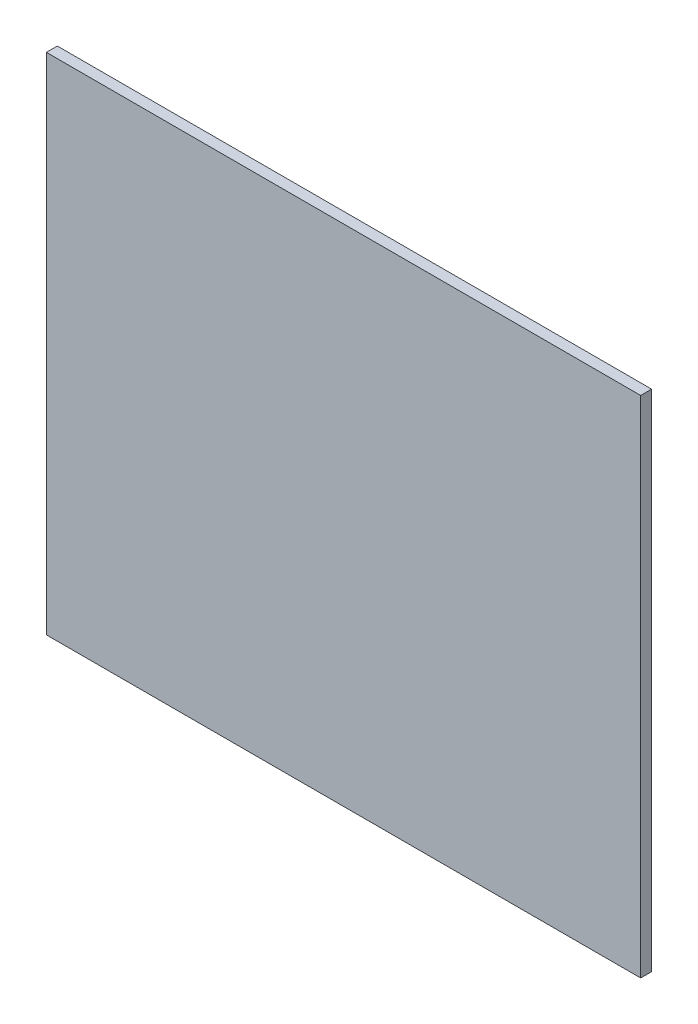
ISO-10303-21;
HEADER;
FILE_DESCRIPTION(('STEP AP214'),'2;1');
FILE_NAME('part.step','',(''),(''),'','','');
FILE_SCHEMA(('AUTOMOTIVE_DESIGN { 1 0 10303 214 1 1 1 1 }'));
ENDSEC;
DATA;
#1=APPLICATION_CONTEXT('core data for automotive mechanical design processes');
#2=APPLICATION_PROTOCOL_DEFINITION('international standard','automotive_design',2000,#1);
#3=PRODUCT_CONTEXT('',#1,'mechanical');
#4=PRODUCT('Part','Part','',(#3));
#5=PRODUCT_RELATED_PRODUCT_CATEGORY('part','',(#4));
#6=PRODUCT_DEFINITION_FORMATION('','',#4);
#7=PRODUCT_DEFINITION_CONTEXT('part definition',#1,'design');
#8=PRODUCT_DEFINITION('design','',#6,#7);
#9=PRODUCT_DEFINITION_SHAPE('','',#8);
#10=(LENGTH_UNIT() NAMED_UNIT(*) SI_UNIT(.MILLI.,.METRE.));
#11=(NAMED_UNIT(*) PLANE_ANGLE_UNIT() SI_UNIT($,.RADIAN.));
#12=(NAMED_UNIT(*) SI_UNIT($,.STERADIAN.) SOLID_ANGLE_UNIT());
#13=UNCERTAINTY_MEASURE_WITH_UNIT(LENGTH_MEASURE(1.E-05),#10,'distance_accuracy_value','');
#14=(GEOMETRIC_REPRESENTATION_CONTEXT(3) GLOBAL_UNCERTAINTY_ASSIGNED_CONTEXT((#13)) GLOBAL_UNIT_ASSIGNED_CONTEXT((#10,
#11,#12)) REPRESENTATION_CONTEXT('',''));
#15=CARTESIAN_POINT('',(0.,0.,0.));
#16=DIRECTION('',(0.,0.,1.));
#17=DIRECTION('',(1.,0.,0.));
#18=AXIS2_PLACEMENT_3D('',#15,#16,#17);
#19=CARTESIAN_POINT('',(0.,0.,1.016));
#20=DIRECTION('',(0.,1.,0.));
#21=DIRECTION('',(0.,0.,1.));
#22=AXIS2_PLACEMENT_3D('',#19,#20,#21);
#23=PLANE('',#22);
#24=DIRECTION('',(1.,0.,0.));
#25=VECTOR('',#24,1.);
#26=CARTESIAN_POINT('',(0.,0.,0.));
#27=LINE('',#26,#25);
#28=CARTESIAN_POINT('',(0.,0.,0.));
#29=VERTEX_POINT('',#28);
#30=CARTESIAN_POINT('',(55.165625,0.,0.));
#31=VERTEX_POINT('',#30);
#32=EDGE_CURVE('E113',#29,#31,#27,.T.);
#33=ORIENTED_EDGE('',*,*,#32,.T.);
#34=DIRECTION('',(0.,0.,-1.));
#35=VECTOR('',#34,1.);
#36=CARTESIAN_POINT('',(55.165625,0.,1.016));
#37=LINE('',#36,#35);
#38=CARTESIAN_POINT('',(55.165625,0.,1.016));
#39=VERTEX_POINT('',#38);
#40=EDGE_CURVE('E11',#39,#31,#37,.T.);
#41=ORIENTED_EDGE('',*,*,#40,.F.);
#42=DIRECTION('',(1.,0.,0.));
#43=VECTOR('',#42,1.);
#44=CARTESIAN_POINT('',(0.,0.,1.016));
#45=LINE('',#44,#43);
#46=CARTESIAN_POINT('',(0.,0.,1.016));
#47=VERTEX_POINT('',#46);
#48=EDGE_CURVE('E95',#47,#39,#45,.T.);
#49=ORIENTED_EDGE('',*,*,#48,.F.);
#50=DIRECTION('',(0.,0.,-1.));
#51=VECTOR('',#50,1.);
#52=CARTESIAN_POINT('',(0.,0.,1.016));
#53=LINE('',#52,#51);
#54=EDGE_CURVE('E62',#47,#29,#53,.T.);
#55=ORIENTED_EDGE('',*,*,#54,.T.);
#56=EDGE_LOOP('',(#33,#41,#49,#55));
#57=FACE_BOUND('',#56,.T.);
#58=ADVANCED_FACE('F45',(#57),#23,.F.);
#59=CARTESIAN_POINT('',(55.165625,0.,1.016));
#60=DIRECTION('',(-1.,0.,0.));
#61=DIRECTION('',(0.,0.,1.));
#62=AXIS2_PLACEMENT_3D('',#59,#60,#61);
#63=PLANE('',#62);
#64=DIRECTION('',(0.,1.,0.));
#65=VECTOR('',#64,1.);
#66=CARTESIAN_POINT('',(55.165625,0.,0.));
#67=LINE('',#66,#65);
#68=CARTESIAN_POINT('',(55.165625,46.827898978,0.));
#69=VERTEX_POINT('',#68);
#70=EDGE_CURVE('E101',#31,#69,#67,.T.);
#71=ORIENTED_EDGE('',*,*,#70,.T.);
#72=DIRECTION('',(0.,0.,-1.));
#73=VECTOR('',#72,1.);
#74=CARTESIAN_POINT('',(55.165625,46.827898978,1.016));
#75=LINE('',#74,#73);
#76=CARTESIAN_POINT('',(55.165625,46.827898978,1.016));
#77=VERTEX_POINT('',#76);
#78=EDGE_CURVE('E54',#77,#69,#75,.T.);
#79=ORIENTED_EDGE('',*,*,#78,.F.);
#80=DIRECTION('',(0.,1.,0.));
#81=VECTOR('',#80,1.);
#82=CARTESIAN_POINT('',(55.165625,0.,1.016));
#83=LINE('',#82,#81);
#84=EDGE_CURVE('E87',#39,#77,#83,.T.);
#85=ORIENTED_EDGE('',*,*,#84,.F.);
#86=ORIENTED_EDGE('',*,*,#40,.T.);
#87=EDGE_LOOP('',(#71,#79,#85,#86));
#88=FACE_BOUND('',#87,.T.);
#89=ADVANCED_FACE('F100',(#88),#63,.F.);
#90=CARTESIAN_POINT('',(0.,46.827898978,1.016));
#91=DIRECTION('',(0.,1.,0.));
#92=DIRECTION('',(0.,0.,1.));
#93=AXIS2_PLACEMENT_3D('',#90,#91,#92);
#94=PLANE('',#93);
#95=DIRECTION('',(1.,0.,0.));
#96=VECTOR('',#95,1.);
#97=CARTESIAN_POINT('',(0.,46.827898978,0.));
#98=LINE('',#97,#96);
#99=CARTESIAN_POINT('',(0.,46.827898978,0.));
#100=VERTEX_POINT('',#99);
#101=EDGE_CURVE('E118',#100,#69,#98,.T.);
#102=ORIENTED_EDGE('',*,*,#101,.F.);
#103=DIRECTION('',(0.,0.,-1.));
#104=VECTOR('',#103,1.);
#105=CARTESIAN_POINT('',(0.,46.827898978,1.016));
#106=LINE('',#105,#104);
#107=CARTESIAN_POINT('',(0.,46.827898978,1.016));
#108=VERTEX_POINT('',#107);
#109=EDGE_CURVE('E76',#108,#100,#106,.T.);
#110=ORIENTED_EDGE('',*,*,#109,.F.);
#111=DIRECTION('',(1.,0.,0.));
#112=VECTOR('',#111,1.);
#113=CARTESIAN_POINT('',(0.,46.827898978,1.016));
#114=LINE('',#113,#112);
#115=EDGE_CURVE('E94',#108,#77,#114,.T.);
#116=ORIENTED_EDGE('',*,*,#115,.T.);
#117=ORIENTED_EDGE('',*,*,#78,.T.);
#118=EDGE_LOOP('',(#102,#110,#116,#117));
#119=FACE_BOUND('',#118,.T.);
#120=ADVANCED_FACE('F105',(#119),#94,.T.);
#121=CARTESIAN_POINT('',(0.,0.,1.016));
#122=DIRECTION('',(-1.,0.,0.));
#123=DIRECTION('',(0.,0.,1.));
#124=AXIS2_PLACEMENT_3D('',#121,#122,#123);
#125=PLANE('',#124);
#126=DIRECTION('',(0.,1.,0.));
#127=VECTOR('',#126,1.);
#128=CARTESIAN_POINT('',(0.,0.,0.));
#129=LINE('',#128,#127);
#130=EDGE_CURVE('E121',#29,#100,#129,.T.);
#131=ORIENTED_EDGE('',*,*,#130,.F.);
#132=ORIENTED_EDGE('',*,*,#54,.F.);
#133=DIRECTION('',(0.,1.,0.));
#134=VECTOR('',#133,1.);
#135=CARTESIAN_POINT('',(0.,0.,1.016));
#136=LINE('',#135,#134);
#137=EDGE_CURVE('E107',#47,#108,#136,.T.);
#138=ORIENTED_EDGE('',*,*,#137,.T.);
#139=ORIENTED_EDGE('',*,*,#109,.T.);
#140=EDGE_LOOP('',(#131,#132,#138,#139));
#141=FACE_BOUND('',#140,.T.);
#142=ADVANCED_FACE('F131',(#141),#125,.T.);
#143=CARTESIAN_POINT('',(0.,0.,1.016));
#144=DIRECTION('',(0.,0.,1.));
#145=DIRECTION('',(1.,0.,0.));
#146=AXIS2_PLACEMENT_3D('',#143,#144,#145);
#147=PLANE('',#146);
#148=ORIENTED_EDGE('',*,*,#48,.T.);
#149=ORIENTED_EDGE('',*,*,#84,.T.);
#150=ORIENTED_EDGE('',*,*,#115,.F.);
#151=ORIENTED_EDGE('',*,*,#137,.F.);
#152=EDGE_LOOP('',(#148,#149,#150,#151));
#153=FACE_BOUND('',#152,.T.);
#154=ADVANCED_FACE('F91',(#153),#147,.T.);
#155=CARTESIAN_POINT('',(0.,0.,0.));
#156=DIRECTION('',(0.,0.,1.));
#157=DIRECTION('',(1.,0.,0.));
#158=AXIS2_PLACEMENT_3D('',#155,#156,#157);
#159=PLANE('',#158);
#160=ORIENTED_EDGE('',*,*,#32,.F.);
#161=ORIENTED_EDGE('',*,*,#130,.T.);
#162=ORIENTED_EDGE('',*,*,#101,.T.);
#163=ORIENTED_EDGE('',*,*,#70,.F.);
#164=EDGE_LOOP('',(#160,#161,#162,#163));
#165=FACE_BOUND('',#164,.T.);
#166=ADVANCED_FACE('F130',(#165),#159,.F.);
#167=CLOSED_SHELL('',(#58,#89,#120,#142,#154,#166));
#168=MANIFOLD_SOLID_BREP('B2',#167);
#169=ADVANCED_BREP_SHAPE_REPRESENTATION('',(#18,#168),#14);
#170=SHAPE_DEFINITION_REPRESENTATION(#9,#169);
ENDSEC;
END-ISO-10303-21;
